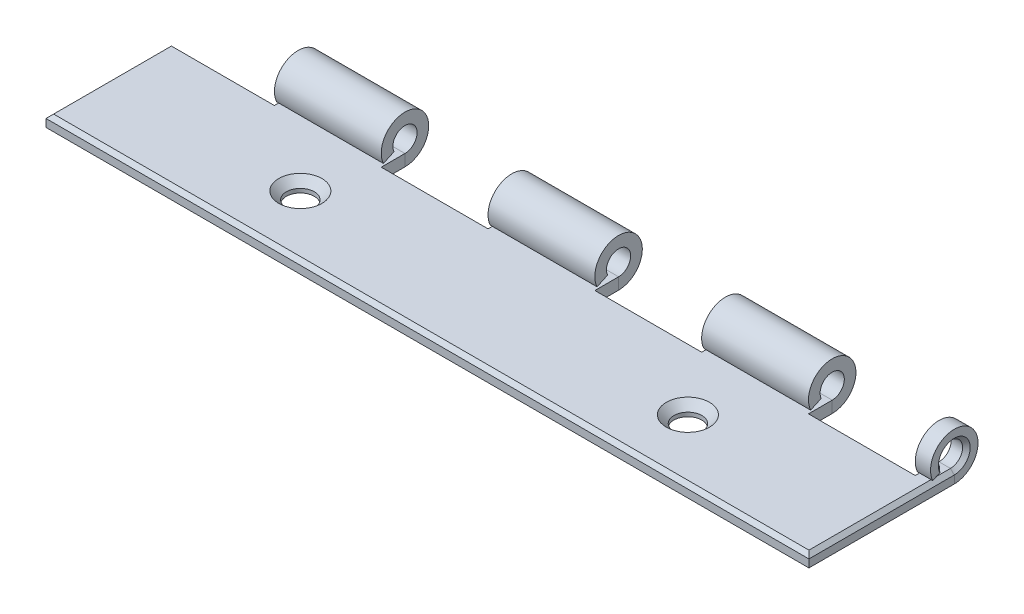
ISO-10303-21;
HEADER;
FILE_DESCRIPTION(('STEP AP214'),'2;1');
FILE_NAME('part.step','',(''),(''),'','','');
FILE_SCHEMA(('AUTOMOTIVE_DESIGN { 1 0 10303 214 1 1 1 1 }'));
ENDSEC;
DATA;
#1=APPLICATION_CONTEXT('core data for automotive mechanical design processes');
#2=APPLICATION_PROTOCOL_DEFINITION('international standard','automotive_design',2000,#1);
#3=PRODUCT_CONTEXT('',#1,'mechanical');
#4=PRODUCT('Part','Part','',(#3));
#5=PRODUCT_RELATED_PRODUCT_CATEGORY('part','',(#4));
#6=PRODUCT_DEFINITION_FORMATION('','',#4);
#7=PRODUCT_DEFINITION_CONTEXT('part definition',#1,'design');
#8=PRODUCT_DEFINITION('design','',#6,#7);
#9=PRODUCT_DEFINITION_SHAPE('','',#8);
#10=(LENGTH_UNIT() NAMED_UNIT(*) SI_UNIT(.MILLI.,.METRE.));
#11=(NAMED_UNIT(*) PLANE_ANGLE_UNIT() SI_UNIT($,.RADIAN.));
#12=(NAMED_UNIT(*) SI_UNIT($,.STERADIAN.) SOLID_ANGLE_UNIT());
#13=UNCERTAINTY_MEASURE_WITH_UNIT(LENGTH_MEASURE(1.E-05),#10,'distance_accuracy_value','');
#14=(GEOMETRIC_REPRESENTATION_CONTEXT(3) GLOBAL_UNCERTAINTY_ASSIGNED_CONTEXT((#13)) GLOBAL_UNIT_ASSIGNED_CONTEXT((#10,
#11,#12)) REPRESENTATION_CONTEXT('',''));
#15=CARTESIAN_POINT('',(0.,0.,0.));
#16=DIRECTION('',(0.,0.,1.));
#17=DIRECTION('',(1.,0.,0.));
#18=AXIS2_PLACEMENT_3D('',#15,#16,#17);
#19=CARTESIAN_POINT('',(34.,-1.524,-4.85775));
#20=DIRECTION('',(-1.,0.,0.));
#21=DIRECTION('',(0.,0.,1.));
#22=AXIS2_PLACEMENT_3D('',#19,#20,#21);
#23=PLANE('',#22);
#24=DIRECTION('',(0.,0.,1.));
#25=VECTOR('',#24,1.);
#26=CARTESIAN_POINT('',(34.,-1.524,-4.85775));
#27=LINE('',#26,#25);
#28=CARTESIAN_POINT('',(34.,-1.524,-7.96925));
#29=VERTEX_POINT('',#28);
#30=CARTESIAN_POINT('',(34.,-1.524,-4.85775));
#31=VERTEX_POINT('',#30);
#32=EDGE_CURVE('E247',#29,#31,#27,.T.);
#33=ORIENTED_EDGE('',*,*,#32,.F.);
#34=DIRECTION('',(0.,1.,0.));
#35=VECTOR('',#34,1.);
#36=CARTESIAN_POINT('',(34.,-1.524,-7.96925));
#37=LINE('',#36,#35);
#38=CARTESIAN_POINT('',(34.,0.,-7.96925));
#39=VERTEX_POINT('',#38);
#40=EDGE_CURVE('E455',#29,#39,#37,.T.);
#41=ORIENTED_EDGE('',*,*,#40,.T.);
#42=DIRECTION('',(0.,0.,-1.));
#43=VECTOR('',#42,1.);
#44=CARTESIAN_POINT('',(34.,0.,0.));
#45=LINE('',#44,#43);
#46=CARTESIAN_POINT('',(34.,0.,-4.85775));
#47=VERTEX_POINT('',#46);
#48=EDGE_CURVE('E250',#47,#39,#45,.T.);
#49=ORIENTED_EDGE('',*,*,#48,.F.);
#50=DIRECTION('',(0.,1.,0.));
#51=VECTOR('',#50,1.);
#52=CARTESIAN_POINT('',(34.,-1.524,-4.85775));
#53=LINE('',#52,#51);
#54=EDGE_CURVE('E244',#31,#47,#53,.T.);
#55=ORIENTED_EDGE('',*,*,#54,.F.);
#56=EDGE_LOOP('',(#33,#41,#49,#55));
#57=FACE_BOUND('',#56,.T.);
#58=ADVANCED_FACE('F53',(#57),#23,.F.);
#59=CARTESIAN_POINT('',(48.,-1.524,-4.85775));
#60=DIRECTION('',(1.,0.,0.));
#61=DIRECTION('',(0.,0.,-1.));
#62=AXIS2_PLACEMENT_3D('',#59,#60,#61);
#63=PLANE('',#62);
#64=DIRECTION('',(0.,0.,1.));
#65=VECTOR('',#64,1.);
#66=CARTESIAN_POINT('',(48.,0.,0.));
#67=LINE('',#66,#65);
#68=CARTESIAN_POINT('',(48.,0.,-7.96925));
#69=VERTEX_POINT('',#68);
#70=CARTESIAN_POINT('',(48.,0.,-4.85775));
#71=VERTEX_POINT('',#70);
#72=EDGE_CURVE('E442',#69,#71,#67,.T.);
#73=ORIENTED_EDGE('',*,*,#72,.F.);
#74=DIRECTION('',(0.,-1.,0.));
#75=VECTOR('',#74,1.);
#76=CARTESIAN_POINT('',(48.,0.,-7.96925));
#77=LINE('',#76,#75);
#78=CARTESIAN_POINT('',(48.,-1.524,-7.96925));
#79=VERTEX_POINT('',#78);
#80=EDGE_CURVE('E453',#69,#79,#77,.T.);
#81=ORIENTED_EDGE('',*,*,#80,.T.);
#82=DIRECTION('',(0.,0.,-1.));
#83=VECTOR('',#82,1.);
#84=CARTESIAN_POINT('',(48.,-1.524,-4.85775));
#85=LINE('',#84,#83);
#86=CARTESIAN_POINT('',(48.,-1.524,-4.85775));
#87=VERTEX_POINT('',#86);
#88=EDGE_CURVE('E271',#87,#79,#85,.T.);
#89=ORIENTED_EDGE('',*,*,#88,.F.);
#90=DIRECTION('',(0.,1.,0.));
#91=VECTOR('',#90,1.);
#92=CARTESIAN_POINT('',(48.,-1.524,-4.85775));
#93=LINE('',#92,#91);
#94=EDGE_CURVE('E254',#87,#71,#93,.T.);
#95=ORIENTED_EDGE('',*,*,#94,.T.);
#96=EDGE_LOOP('',(#73,#81,#89,#95));
#97=FACE_BOUND('',#96,.T.);
#98=ADVANCED_FACE('F530',(#97),#63,.F.);
#99=CARTESIAN_POINT('',(6.,-1.524,-4.85775));
#100=DIRECTION('',(-1.,0.,0.));
#101=DIRECTION('',(0.,0.,1.));
#102=AXIS2_PLACEMENT_3D('',#99,#100,#101);
#103=PLANE('',#102);
#104=DIRECTION('',(0.,0.,1.));
#105=VECTOR('',#104,1.);
#106=CARTESIAN_POINT('',(6.,-1.524,-4.85775));
#107=LINE('',#106,#105);
#108=CARTESIAN_POINT('',(6.,-1.524,-7.96925));
#109=VERTEX_POINT('',#108);
#110=CARTESIAN_POINT('',(6.,-1.524,-4.85775));
#111=VERTEX_POINT('',#110);
#112=EDGE_CURVE('E295',#109,#111,#107,.T.);
#113=ORIENTED_EDGE('',*,*,#112,.F.);
#114=DIRECTION('',(0.,1.,0.));
#115=VECTOR('',#114,1.);
#116=CARTESIAN_POINT('',(6.,-1.524,-7.96925));
#117=LINE('',#116,#115);
#118=CARTESIAN_POINT('',(6.,0.,-7.96925));
#119=VERTEX_POINT('',#118);
#120=EDGE_CURVE('E451',#109,#119,#117,.T.);
#121=ORIENTED_EDGE('',*,*,#120,.T.);
#122=DIRECTION('',(0.,0.,-1.));
#123=VECTOR('',#122,1.);
#124=CARTESIAN_POINT('',(6.,0.,0.));
#125=LINE('',#124,#123);
#126=CARTESIAN_POINT('',(6.,0.,-4.85775));
#127=VERTEX_POINT('',#126);
#128=EDGE_CURVE('E430',#127,#119,#125,.T.);
#129=ORIENTED_EDGE('',*,*,#128,.F.);
#130=DIRECTION('',(0.,1.,0.));
#131=VECTOR('',#130,1.);
#132=CARTESIAN_POINT('',(6.,-1.524,-4.85775));
#133=LINE('',#132,#131);
#134=EDGE_CURVE('E301',#111,#127,#133,.T.);
#135=ORIENTED_EDGE('',*,*,#134,.F.);
#136=EDGE_LOOP('',(#113,#121,#129,#135));
#137=FACE_BOUND('',#136,.T.);
#138=ADVANCED_FACE('F536',(#137),#103,.F.);
#139=CARTESIAN_POINT('',(20.,-1.524,-4.85775));
#140=DIRECTION('',(1.,0.,0.));
#141=DIRECTION('',(0.,0.,-1.));
#142=AXIS2_PLACEMENT_3D('',#139,#140,#141);
#143=PLANE('',#142);
#144=DIRECTION('',(0.,0.,1.));
#145=VECTOR('',#144,1.);
#146=CARTESIAN_POINT('',(20.,0.,0.));
#147=LINE('',#146,#145);
#148=CARTESIAN_POINT('',(20.,0.,-7.96925));
#149=VERTEX_POINT('',#148);
#150=CARTESIAN_POINT('',(20.,0.,-4.85775));
#151=VERTEX_POINT('',#150);
#152=EDGE_CURVE('E436',#149,#151,#147,.T.);
#153=ORIENTED_EDGE('',*,*,#152,.F.);
#154=DIRECTION('',(0.,-1.,0.));
#155=VECTOR('',#154,1.);
#156=CARTESIAN_POINT('',(20.,0.,-7.96925));
#157=LINE('',#156,#155);
#158=CARTESIAN_POINT('',(20.,-1.524,-7.96925));
#159=VERTEX_POINT('',#158);
#160=EDGE_CURVE('E449',#149,#159,#157,.T.);
#161=ORIENTED_EDGE('',*,*,#160,.T.);
#162=DIRECTION('',(0.,0.,-1.));
#163=VECTOR('',#162,1.);
#164=CARTESIAN_POINT('',(20.,-1.524,-4.85775));
#165=LINE('',#164,#163);
#166=CARTESIAN_POINT('',(20.,-1.524,-4.85775));
#167=VERTEX_POINT('',#166);
#168=EDGE_CURVE('E293',#167,#159,#165,.T.);
#169=ORIENTED_EDGE('',*,*,#168,.F.);
#170=DIRECTION('',(0.,1.,0.));
#171=VECTOR('',#170,1.);
#172=CARTESIAN_POINT('',(20.,-1.524,-4.85775));
#173=LINE('',#172,#171);
#174=EDGE_CURVE('E302',#167,#151,#173,.T.);
#175=ORIENTED_EDGE('',*,*,#174,.T.);
#176=EDGE_LOOP('',(#153,#161,#169,#175));
#177=FACE_BOUND('',#176,.T.);
#178=ADVANCED_FACE('F871',(#177),#143,.F.);
#179=CARTESIAN_POINT('',(-22.,-1.524,-4.85775));
#180=DIRECTION('',(-1.,0.,0.));
#181=DIRECTION('',(0.,0.,1.));
#182=AXIS2_PLACEMENT_3D('',#179,#180,#181);
#183=PLANE('',#182);
#184=DIRECTION('',(0.,0.,1.));
#185=VECTOR('',#184,1.);
#186=CARTESIAN_POINT('',(-22.,-1.524,-4.85775));
#187=LINE('',#186,#185);
#188=CARTESIAN_POINT('',(-22.,-1.524,-7.96925));
#189=VERTEX_POINT('',#188);
#190=CARTESIAN_POINT('',(-22.,-1.524,-4.85775));
#191=VERTEX_POINT('',#190);
#192=EDGE_CURVE('E326',#189,#191,#187,.T.);
#193=ORIENTED_EDGE('',*,*,#192,.F.);
#194=DIRECTION('',(0.,1.,0.));
#195=VECTOR('',#194,1.);
#196=CARTESIAN_POINT('',(-22.,-1.524,-7.96925));
#197=LINE('',#196,#195);
#198=CARTESIAN_POINT('',(-22.,0.,-7.96925));
#199=VERTEX_POINT('',#198);
#200=EDGE_CURVE('E447',#189,#199,#197,.T.);
#201=ORIENTED_EDGE('',*,*,#200,.T.);
#202=DIRECTION('',(0.,0.,-1.));
#203=VECTOR('',#202,1.);
#204=CARTESIAN_POINT('',(-22.,0.,0.));
#205=LINE('',#204,#203);
#206=CARTESIAN_POINT('',(-22.,0.,-4.85775));
#207=VERTEX_POINT('',#206);
#208=EDGE_CURVE('E340',#207,#199,#205,.T.);
#209=ORIENTED_EDGE('',*,*,#208,.F.);
#210=DIRECTION('',(0.,1.,0.));
#211=VECTOR('',#210,1.);
#212=CARTESIAN_POINT('',(-22.,-1.524,-4.85775));
#213=LINE('',#212,#211);
#214=EDGE_CURVE('E332',#191,#207,#213,.T.);
#215=ORIENTED_EDGE('',*,*,#214,.F.);
#216=EDGE_LOOP('',(#193,#201,#209,#215));
#217=FACE_BOUND('',#216,.T.);
#218=ADVANCED_FACE('F888',(#217),#183,.F.);
#219=CARTESIAN_POINT('',(-8.,-1.524,-4.85775));
#220=DIRECTION('',(1.,0.,0.));
#221=DIRECTION('',(0.,0.,-1.));
#222=AXIS2_PLACEMENT_3D('',#219,#220,#221);
#223=PLANE('',#222);
#224=DIRECTION('',(0.,0.,1.));
#225=VECTOR('',#224,1.);
#226=CARTESIAN_POINT('',(-8.,0.,0.));
#227=LINE('',#226,#225);
#228=CARTESIAN_POINT('',(-8.00000000000001,0.,-7.96925));
#229=VERTEX_POINT('',#228);
#230=CARTESIAN_POINT('',(-8.,0.,-4.85775));
#231=VERTEX_POINT('',#230);
#232=EDGE_CURVE('E348',#229,#231,#227,.T.);
#233=ORIENTED_EDGE('',*,*,#232,.F.);
#234=DIRECTION('',(0.,-1.,0.));
#235=VECTOR('',#234,1.);
#236=CARTESIAN_POINT('',(-8.00000000000001,0.,-7.96925));
#237=LINE('',#236,#235);
#238=CARTESIAN_POINT('',(-8.,-1.524,-7.96925));
#239=VERTEX_POINT('',#238);
#240=EDGE_CURVE('E445',#229,#239,#237,.T.);
#241=ORIENTED_EDGE('',*,*,#240,.T.);
#242=DIRECTION('',(0.,0.,-1.));
#243=VECTOR('',#242,1.);
#244=CARTESIAN_POINT('',(-8.,-1.524,-4.85775));
#245=LINE('',#244,#243);
#246=CARTESIAN_POINT('',(-8.,-1.524,-4.85775));
#247=VERTEX_POINT('',#246);
#248=EDGE_CURVE('E323',#247,#239,#245,.T.);
#249=ORIENTED_EDGE('',*,*,#248,.F.);
#250=DIRECTION('',(0.,1.,0.));
#251=VECTOR('',#250,1.);
#252=CARTESIAN_POINT('',(-8.,-1.524,-4.85775));
#253=LINE('',#252,#251);
#254=EDGE_CURVE('E333',#247,#231,#253,.T.);
#255=ORIENTED_EDGE('',*,*,#254,.T.);
#256=EDGE_LOOP('',(#233,#241,#249,#255));
#257=FACE_BOUND('',#256,.T.);
#258=ADVANCED_FACE('F658',(#257),#223,.F.);
#259=CARTESIAN_POINT('',(0.,0.916593509486624,-6.53048638807933));
#260=DIRECTION('',(0.,0.906307787036645,0.42261826174071));
#261=DIRECTION('',(-1.,0.,0.));
#262=AXIS2_PLACEMENT_3D('',#259,#260,#261);
#263=PLANE('',#262);
#264=DIRECTION('',(-1.,0.,0.));
#265=VECTOR('',#264,1.);
#266=CARTESIAN_POINT('',(-50.,0.916593509486624,-6.53048638807933));
#267=LINE('',#266,#265);
#268=CARTESIAN_POINT('',(49.5,0.916593509486624,-6.53048638807933));
#269=VERTEX_POINT('',#268);
#270=CARTESIAN_POINT('',(48.,0.916593509486624,-6.53048638807933));
#271=VERTEX_POINT('',#270);
#272=EDGE_CURVE('E401',#269,#271,#267,.T.);
#273=ORIENTED_EDGE('',*,*,#272,.F.);
#274=DIRECTION('',(0.707106781186548,-0.298836238730127,0.640856382055785));
#275=VECTOR('',#274,1.);
#276=CARTESIAN_POINT('',(47.9125,1.5875,-7.96925));
#277=LINE('',#276,#275);
#278=CARTESIAN_POINT('',(50.,0.705284378616269,-6.077332494561));
#279=VERTEX_POINT('',#278);
#280=EDGE_CURVE('E460',#269,#279,#277,.T.);
#281=ORIENTED_EDGE('',*,*,#280,.T.);
#282=DIRECTION('',(0.,-0.42261826174071,0.906307787036645));
#283=VECTOR('',#282,1.);
#284=CARTESIAN_POINT('',(50.,0.916593509486624,-6.53048638807933));
#285=LINE('',#284,#283);
#286=CARTESIAN_POINT('',(50.,0.272523278593782,-5.14927332063548));
#287=VERTEX_POINT('',#286);
#288=EDGE_CURVE('E405',#279,#287,#285,.T.);
#289=ORIENTED_EDGE('',*,*,#288,.T.);
#290=DIRECTION('',(-1.,0.,0.));
#291=VECTOR('',#290,1.);
#292=CARTESIAN_POINT('',(-50.,0.272523278593782,-5.14927332063548));
#293=LINE('',#292,#291);
#294=CARTESIAN_POINT('',(48.,0.272523278593782,-5.14927332063548));
#295=VERTEX_POINT('',#294);
#296=EDGE_CURVE('E391',#287,#295,#293,.T.);
#297=ORIENTED_EDGE('',*,*,#296,.T.);
#298=DIRECTION('',(0.,0.42261826174071,-0.906307787036645));
#299=VECTOR('',#298,1.);
#300=CARTESIAN_POINT('',(48.,0.916593509486624,-6.53048638807933));
#301=LINE('',#300,#299);
#302=EDGE_CURVE('E288',#271,#295,#301,.F.);
#303=ORIENTED_EDGE('',*,*,#302,.F.);
#304=EDGE_LOOP('',(#273,#281,#289,#297,#303));
#305=FACE_BOUND('',#304,.T.);
#306=ADVANCED_FACE('F579',(#305),#263,.F.);
#307=CARTESIAN_POINT('',(-50.,1.5875,-7.96925));
#308=DIRECTION('',(-1.,0.,0.));
#309=DIRECTION('',(0.,-0.42261826174071,0.906307787036645));
#310=AXIS2_PLACEMENT_3D('',#307,#308,#309);
#311=CYLINDRICAL_SURFACE('',#310,3.1115);
#312=DIRECTION('',(-1.,0.,0.));
#313=VECTOR('',#312,1.);
#314=CARTESIAN_POINT('',(-50.,-1.524,-7.96925000000001));
#315=LINE('',#314,#313);
#316=CARTESIAN_POINT('',(50.,-1.524,-7.96925000000001));
#317=VERTEX_POINT('',#316);
#318=EDGE_CURVE('E387',#79,#317,#315,.F.);
#319=ORIENTED_EDGE('',*,*,#318,.F.);
#320=CARTESIAN_POINT('',(48.,1.5875,-7.96925));
#321=DIRECTION('',(1.,0.,0.));
#322=DIRECTION('',(0.,0.,-1.));
#323=AXIS2_PLACEMENT_3D('',#320,#321,#322);
#324=CIRCLE('',#323,3.1115);
#325=EDGE_CURVE('E290',#295,#79,#324,.F.);
#326=ORIENTED_EDGE('',*,*,#325,.F.);
#327=ORIENTED_EDGE('',*,*,#296,.F.);
#328=CARTESIAN_POINT('',(50.,1.5875,-7.96925));
#329=DIRECTION('',(-1.,0.,0.));
#330=DIRECTION('',(0.,0.,1.));
#331=AXIS2_PLACEMENT_3D('',#328,#329,#330);
#332=CIRCLE('',#331,3.1115);
#333=EDGE_CURVE('E385',#317,#287,#332,.F.);
#334=ORIENTED_EDGE('',*,*,#333,.F.);
#335=EDGE_LOOP('',(#319,#326,#327,#334));
#336=FACE_BOUND('',#335,.T.);
#337=ADVANCED_FACE('F588',(#336),#311,.T.);
#338=CARTESIAN_POINT('',(-50.,1.5875,-7.96925));
#339=DIRECTION('',(-1.,0.,0.));
#340=DIRECTION('',(0.,-0.42261826174071,0.906307787036645));
#341=AXIS2_PLACEMENT_3D('',#338,#339,#340);
#342=CYLINDRICAL_SURFACE('',#341,1.5875);
#343=DIRECTION('',(-1.,0.,0.));
#344=VECTOR('',#343,1.);
#345=CARTESIAN_POINT('',(-50.,0.,-7.96925));
#346=LINE('',#345,#344);
#347=CARTESIAN_POINT('',(49.5,0.,-7.96925));
#348=VERTEX_POINT('',#347);
#349=EDGE_CURVE('E400',#69,#348,#346,.F.);
#350=ORIENTED_EDGE('',*,*,#349,.T.);
#351=CARTESIAN_POINT('',(49.5,1.5875,-7.96925));
#352=DIRECTION('',(1.,0.,0.));
#353=DIRECTION('',(0.,0.,-1.));
#354=AXIS2_PLACEMENT_3D('',#351,#352,#353);
#355=CIRCLE('',#354,1.5875);
#356=EDGE_CURVE('E457',#348,#269,#355,.T.);
#357=ORIENTED_EDGE('',*,*,#356,.T.);
#358=ORIENTED_EDGE('',*,*,#272,.T.);
#359=CARTESIAN_POINT('',(48.,1.5875,-7.96925));
#360=DIRECTION('',(1.,0.,0.));
#361=DIRECTION('',(0.,0.,-1.));
#362=AXIS2_PLACEMENT_3D('',#359,#360,#361);
#363=CIRCLE('',#362,1.5875);
#364=EDGE_CURVE('E285',#271,#69,#363,.F.);
#365=ORIENTED_EDGE('',*,*,#364,.T.);
#366=EDGE_LOOP('',(#350,#357,#358,#365));
#367=FACE_BOUND('',#366,.T.);
#368=ADVANCED_FACE('F567',(#367),#342,.F.);
#369=DIRECTION('',(0.,-0.42261826174071,0.906307787036645));
#370=VECTOR('',#369,1.);
#371=CARTESIAN_POINT('',(34.,0.916593509486624,-6.53048638807933));
#372=LINE('',#371,#370);
#373=CARTESIAN_POINT('',(34.,0.272523278593782,-5.14927332063548));
#374=VERTEX_POINT('',#373);
#375=CARTESIAN_POINT('',(34.,0.916593509486624,-6.53048638807933));
#376=VERTEX_POINT('',#375);
#377=EDGE_CURVE('E281',#374,#376,#372,.F.);
#378=ORIENTED_EDGE('',*,*,#377,.F.);
#379=CARTESIAN_POINT('',(20.,0.272523278593782,-5.14927332063548));
#380=VERTEX_POINT('',#379);
#381=EDGE_CURVE('E394',#374,#380,#293,.T.);
#382=ORIENTED_EDGE('',*,*,#381,.T.);
#383=DIRECTION('',(0.,0.42261826174071,-0.906307787036645));
#384=VECTOR('',#383,1.);
#385=CARTESIAN_POINT('',(20.,0.916593509486624,-6.53048638807933));
#386=LINE('',#385,#384);
#387=CARTESIAN_POINT('',(20.,0.916593509486624,-6.53048638807933));
#388=VERTEX_POINT('',#387);
#389=EDGE_CURVE('E317',#388,#380,#386,.F.);
#390=ORIENTED_EDGE('',*,*,#389,.F.);
#391=EDGE_CURVE('E403',#376,#388,#267,.T.);
#392=ORIENTED_EDGE('',*,*,#391,.F.);
#393=EDGE_LOOP('',(#378,#382,#390,#392));
#394=FACE_BOUND('',#393,.T.);
#395=ADVANCED_FACE('F636',(#394),#263,.F.);
#396=CARTESIAN_POINT('',(34.,1.5875,-7.96925));
#397=DIRECTION('',(-1.,0.,0.));
#398=DIRECTION('',(0.,0.,1.));
#399=AXIS2_PLACEMENT_3D('',#396,#397,#398);
#400=CIRCLE('',#399,3.1115);
#401=EDGE_CURVE('E283',#29,#374,#400,.F.);
#402=ORIENTED_EDGE('',*,*,#401,.F.);
#403=EDGE_CURVE('E269',#159,#29,#315,.F.);
#404=ORIENTED_EDGE('',*,*,#403,.F.);
#405=CARTESIAN_POINT('',(20.,1.5875,-7.96925));
#406=DIRECTION('',(1.,0.,0.));
#407=DIRECTION('',(0.,0.,-1.));
#408=AXIS2_PLACEMENT_3D('',#405,#406,#407);
#409=CIRCLE('',#408,3.1115);
#410=EDGE_CURVE('E320',#380,#159,#409,.F.);
#411=ORIENTED_EDGE('',*,*,#410,.F.);
#412=ORIENTED_EDGE('',*,*,#381,.F.);
#413=EDGE_LOOP('',(#402,#404,#411,#412));
#414=FACE_BOUND('',#413,.T.);
#415=ADVANCED_FACE('F668',(#414),#311,.T.);
#416=EDGE_CURVE('E559',#149,#39,#346,.F.);
#417=ORIENTED_EDGE('',*,*,#416,.T.);
#418=CARTESIAN_POINT('',(34.,1.5875,-7.96925));
#419=DIRECTION('',(-1.,0.,0.));
#420=DIRECTION('',(0.,0.,1.));
#421=AXIS2_PLACEMENT_3D('',#418,#419,#420);
#422=CIRCLE('',#421,1.5875);
#423=EDGE_CURVE('E277',#39,#376,#422,.F.);
#424=ORIENTED_EDGE('',*,*,#423,.T.);
#425=ORIENTED_EDGE('',*,*,#391,.T.);
#426=CARTESIAN_POINT('',(20.,1.5875,-7.96925));
#427=DIRECTION('',(1.,0.,0.));
#428=DIRECTION('',(0.,0.,-1.));
#429=AXIS2_PLACEMENT_3D('',#426,#427,#428);
#430=CIRCLE('',#429,1.5875);
#431=EDGE_CURVE('E314',#388,#149,#430,.F.);
#432=ORIENTED_EDGE('',*,*,#431,.T.);
#433=EDGE_LOOP('',(#417,#424,#425,#432));
#434=FACE_BOUND('',#433,.T.);
#435=ADVANCED_FACE('F560',(#434),#342,.F.);
#436=DIRECTION('',(0.,-0.42261826174071,0.906307787036645));
#437=VECTOR('',#436,1.);
#438=CARTESIAN_POINT('',(6.,0.916593509486624,-6.53048638807933));
#439=LINE('',#438,#437);
#440=CARTESIAN_POINT('',(6.,0.272523278593782,-5.14927332063548));
#441=VERTEX_POINT('',#440);
#442=CARTESIAN_POINT('',(6.,0.916593509486624,-6.53048638807933));
#443=VERTEX_POINT('',#442);
#444=EDGE_CURVE('E310',#441,#443,#439,.F.);
#445=ORIENTED_EDGE('',*,*,#444,.F.);
#446=CARTESIAN_POINT('',(-8.,0.272523278593782,-5.14927332063548));
#447=VERTEX_POINT('',#446);
#448=EDGE_CURVE('E639',#441,#447,#293,.T.);
#449=ORIENTED_EDGE('',*,*,#448,.T.);
#450=DIRECTION('',(0.,0.42261826174071,-0.906307787036645));
#451=VECTOR('',#450,1.);
#452=CARTESIAN_POINT('',(-8.,0.916593509486624,-6.53048638807933));
#453=LINE('',#452,#451);
#454=CARTESIAN_POINT('',(-8.00000000000001,0.916593509486624,-6.53048638807933));
#455=VERTEX_POINT('',#454);
#456=EDGE_CURVE('E345',#455,#447,#453,.F.);
#457=ORIENTED_EDGE('',*,*,#456,.F.);
#458=EDGE_CURVE('E626',#443,#455,#267,.T.);
#459=ORIENTED_EDGE('',*,*,#458,.F.);
#460=EDGE_LOOP('',(#445,#449,#457,#459));
#461=FACE_BOUND('',#460,.T.);
#462=ADVANCED_FACE('F644',(#461),#263,.F.);
#463=CARTESIAN_POINT('',(6.,1.5875,-7.96925));
#464=DIRECTION('',(-1.,0.,0.));
#465=DIRECTION('',(0.,0.,1.));
#466=AXIS2_PLACEMENT_3D('',#463,#464,#465);
#467=CIRCLE('',#466,3.1115);
#468=EDGE_CURVE('E312',#109,#441,#467,.F.);
#469=ORIENTED_EDGE('',*,*,#468,.F.);
#470=EDGE_CURVE('E386',#239,#109,#315,.F.);
#471=ORIENTED_EDGE('',*,*,#470,.F.);
#472=CARTESIAN_POINT('',(-8.00000000000001,1.5875,-7.96925));
#473=DIRECTION('',(1.,0.,0.));
#474=DIRECTION('',(0.,0.,-1.));
#475=AXIS2_PLACEMENT_3D('',#472,#473,#474);
#476=CIRCLE('',#475,3.1115);
#477=EDGE_CURVE('E351',#447,#239,#476,.F.);
#478=ORIENTED_EDGE('',*,*,#477,.F.);
#479=ORIENTED_EDGE('',*,*,#448,.F.);
#480=EDGE_LOOP('',(#469,#471,#478,#479));
#481=FACE_BOUND('',#480,.T.);
#482=ADVANCED_FACE('F651',(#481),#311,.T.);
#483=EDGE_CURVE('E399',#229,#119,#346,.F.);
#484=ORIENTED_EDGE('',*,*,#483,.T.);
#485=CARTESIAN_POINT('',(6.,1.5875,-7.96925));
#486=DIRECTION('',(-1.,0.,0.));
#487=DIRECTION('',(0.,0.,1.));
#488=AXIS2_PLACEMENT_3D('',#485,#486,#487);
#489=CIRCLE('',#488,1.5875);
#490=EDGE_CURVE('E305',#119,#443,#489,.F.);
#491=ORIENTED_EDGE('',*,*,#490,.T.);
#492=ORIENTED_EDGE('',*,*,#458,.T.);
#493=CARTESIAN_POINT('',(-8.00000000000001,1.5875,-7.96925));
#494=DIRECTION('',(1.,0.,0.));
#495=DIRECTION('',(0.,0.,-1.));
#496=AXIS2_PLACEMENT_3D('',#493,#494,#495);
#497=CIRCLE('',#496,1.5875);
#498=EDGE_CURVE('E427',#455,#229,#497,.F.);
#499=ORIENTED_EDGE('',*,*,#498,.T.);
#500=EDGE_LOOP('',(#484,#491,#492,#499));
#501=FACE_BOUND('',#500,.T.);
#502=ADVANCED_FACE('F660',(#501),#342,.F.);
#503=CARTESIAN_POINT('',(-36.,-1.524,-4.85775));
#504=DIRECTION('',(1.,0.,0.));
#505=DIRECTION('',(0.,0.,-1.));
#506=AXIS2_PLACEMENT_3D('',#503,#504,#505);
#507=PLANE('',#506);
#508=DIRECTION('',(0.,0.,1.));
#509=VECTOR('',#508,1.);
#510=CARTESIAN_POINT('',(-36.,0.,0.));
#511=LINE('',#510,#509);
#512=CARTESIAN_POINT('',(-36.,0.,-7.96925));
#513=VERTEX_POINT('',#512);
#514=CARTESIAN_POINT('',(-36.,0.,-4.85775));
#515=VERTEX_POINT('',#514);
#516=EDGE_CURVE('E372',#513,#515,#511,.T.);
#517=ORIENTED_EDGE('',*,*,#516,.F.);
#518=DIRECTION('',(0.,-1.,0.));
#519=VECTOR('',#518,1.);
#520=CARTESIAN_POINT('',(-36.,0.,-7.96925));
#521=LINE('',#520,#519);
#522=CARTESIAN_POINT('',(-36.,-1.524,-7.96925));
#523=VERTEX_POINT('',#522);
#524=EDGE_CURVE('E422',#513,#523,#521,.T.);
#525=ORIENTED_EDGE('',*,*,#524,.T.);
#526=DIRECTION('',(0.,0.,-1.));
#527=VECTOR('',#526,1.);
#528=CARTESIAN_POINT('',(-36.,-1.524,-4.85775));
#529=LINE('',#528,#527);
#530=CARTESIAN_POINT('',(-36.,-1.524,-4.85775));
#531=VERTEX_POINT('',#530);
#532=EDGE_CURVE('E357',#531,#523,#529,.T.);
#533=ORIENTED_EDGE('',*,*,#532,.F.);
#534=DIRECTION('',(0.,1.,0.));
#535=VECTOR('',#534,1.);
#536=CARTESIAN_POINT('',(-36.,-1.524,-4.85775));
#537=LINE('',#536,#535);
#538=EDGE_CURVE('E364',#531,#515,#537,.T.);
#539=ORIENTED_EDGE('',*,*,#538,.T.);
#540=EDGE_LOOP('',(#517,#525,#533,#539));
#541=FACE_BOUND('',#540,.T.);
#542=ADVANCED_FACE('F609',(#541),#507,.F.);
#543=CARTESIAN_POINT('',(-50.,-1.524,11.08075));
#544=DIRECTION('',(-1.,0.,0.));
#545=DIRECTION('',(0.,0.,1.));
#546=AXIS2_PLACEMENT_3D('',#543,#544,#545);
#547=PLANE('',#546);
#548=DIRECTION('',(0.,1.,0.));
#549=VECTOR('',#548,1.);
#550=CARTESIAN_POINT('',(-50.,-1.524,11.08075));
#551=LINE('',#550,#549);
#552=CARTESIAN_POINT('',(-50.,-1.524,11.08075));
#553=VERTEX_POINT('',#552);
#554=CARTESIAN_POINT('',(-50.,-0.5,11.08075));
#555=VERTEX_POINT('',#554);
#556=EDGE_CURVE('E415',#553,#555,#551,.T.);
#557=ORIENTED_EDGE('',*,*,#556,.T.);
#558=DIRECTION('',(0.,0.,-1.));
#559=VECTOR('',#558,1.);
#560=CARTESIAN_POINT('',(-50.,-0.5,-4.85775));
#561=LINE('',#560,#559);
#562=CARTESIAN_POINT('',(-50.,-0.500000000000001,-4.85775));
#563=VERTEX_POINT('',#562);
#564=EDGE_CURVE('E470',#555,#563,#561,.T.);
#565=ORIENTED_EDGE('',*,*,#564,.T.);
#566=DIRECTION('',(0.,1.,0.));
#567=VECTOR('',#566,1.);
#568=CARTESIAN_POINT('',(-50.,-1.524,-4.85775));
#569=LINE('',#568,#567);
#570=CARTESIAN_POINT('',(-50.,-1.524,-4.85775));
#571=VERTEX_POINT('',#570);
#572=EDGE_CURVE('E363',#571,#563,#569,.T.);
#573=ORIENTED_EDGE('',*,*,#572,.F.);
#574=DIRECTION('',(0.,0.,1.));
#575=VECTOR('',#574,1.);
#576=CARTESIAN_POINT('',(-50.,-1.524,11.08075));
#577=LINE('',#576,#575);
#578=EDGE_CURVE('E410',#571,#553,#577,.T.);
#579=ORIENTED_EDGE('',*,*,#578,.T.);
#580=EDGE_LOOP('',(#557,#565,#573,#579));
#581=FACE_BOUND('',#580,.T.);
#582=ADVANCED_FACE('F595',(#581),#547,.T.);
#583=CARTESIAN_POINT('',(50.,-1.524,11.08075));
#584=DIRECTION('',(1.,0.,0.));
#585=DIRECTION('',(0.,0.,-1.));
#586=AXIS2_PLACEMENT_3D('',#583,#584,#585);
#587=PLANE('',#586);
#588=DIRECTION('',(0.,-1.,0.));
#589=VECTOR('',#588,1.);
#590=CARTESIAN_POINT('',(50.,0.,-7.96925));
#591=LINE('',#590,#589);
#592=CARTESIAN_POINT('',(50.,-0.5,-7.96925));
#593=VERTEX_POINT('',#592);
#594=EDGE_CURVE('E390',#593,#317,#591,.T.);
#595=ORIENTED_EDGE('',*,*,#594,.F.);
#596=DIRECTION('',(0.,0.,1.));
#597=VECTOR('',#596,1.);
#598=CARTESIAN_POINT('',(50.,-0.5,11.08075));
#599=LINE('',#598,#597);
#600=CARTESIAN_POINT('',(50.,-0.5,11.08075));
#601=VERTEX_POINT('',#600);
#602=EDGE_CURVE('E68',#593,#601,#599,.T.);
#603=ORIENTED_EDGE('',*,*,#602,.T.);
#604=DIRECTION('',(0.,1.,0.));
#605=VECTOR('',#604,1.);
#606=CARTESIAN_POINT('',(50.,-1.524,11.08075));
#607=LINE('',#606,#605);
#608=CARTESIAN_POINT('',(50.,-1.524,11.08075));
#609=VERTEX_POINT('',#608);
#610=EDGE_CURVE('E416',#609,#601,#607,.T.);
#611=ORIENTED_EDGE('',*,*,#610,.F.);
#612=DIRECTION('',(0.,0.,-1.));
#613=VECTOR('',#612,1.);
#614=CARTESIAN_POINT('',(50.,-1.524,11.08075));
#615=LINE('',#614,#613);
#616=EDGE_CURVE('E407',#609,#317,#615,.T.);
#617=ORIENTED_EDGE('',*,*,#616,.T.);
#618=EDGE_LOOP('',(#595,#603,#611,#617));
#619=FACE_BOUND('',#618,.T.);
#620=ADVANCED_FACE('F526',(#619),#587,.T.);
#621=CARTESIAN_POINT('',(-50.,-1.524,11.08075));
#622=DIRECTION('',(0.,0.,1.));
#623=DIRECTION('',(1.,0.,0.));
#624=AXIS2_PLACEMENT_3D('',#621,#622,#623);
#625=PLANE('',#624);
#626=ORIENTED_EDGE('',*,*,#610,.T.);
#627=DIRECTION('',(-1.,0.,0.));
#628=VECTOR('',#627,1.);
#629=CARTESIAN_POINT('',(-50.,-0.5,11.08075));
#630=LINE('',#629,#628);
#631=EDGE_CURVE('E75',#601,#555,#630,.T.);
#632=ORIENTED_EDGE('',*,*,#631,.T.);
#633=ORIENTED_EDGE('',*,*,#556,.F.);
#634=DIRECTION('',(1.,0.,0.));
#635=VECTOR('',#634,1.);
#636=CARTESIAN_POINT('',(-50.,-1.524,11.08075));
#637=LINE('',#636,#635);
#638=EDGE_CURVE('E412',#553,#609,#637,.T.);
#639=ORIENTED_EDGE('',*,*,#638,.T.);
#640=EDGE_LOOP('',(#626,#632,#633,#639));
#641=FACE_BOUND('',#640,.T.);
#642=ADVANCED_FACE('F518',(#641),#625,.T.);
#643=CARTESIAN_POINT('',(0.,-1.524,0.));
#644=DIRECTION('',(0.,-1.,0.));
#645=DIRECTION('',(0.,0.,-1.));
#646=AXIS2_PLACEMENT_3D('',#643,#644,#645);
#647=PLANE('',#646);
#648=CARTESIAN_POINT('',(26.2,-1.524,3.14324999999998));
#649=DIRECTION('',(0.,-1.,0.));
#650=DIRECTION('',(0.,0.,-1.));
#651=AXIS2_PLACEMENT_3D('',#648,#649,#650);
#652=CIRCLE('',#651,1.82879999999998);
#653=CARTESIAN_POINT('',(26.2,-1.524,1.31445));
#654=VERTEX_POINT('',#653);
#655=EDGE_CURVE('E510',#654,#654,#652,.T.);
#656=ORIENTED_EDGE('',*,*,#655,.F.);
#657=EDGE_LOOP('',(#656));
#658=FACE_BOUND('',#657,.T.);
#659=CARTESIAN_POINT('',(-24.6,-1.524,3.14324999999998));
#660=DIRECTION('',(0.,-1.,0.));
#661=DIRECTION('',(0.,0.,-1.));
#662=AXIS2_PLACEMENT_3D('',#659,#660,#661);
#663=CIRCLE('',#662,1.82879999999998);
#664=CARTESIAN_POINT('',(-24.6,-1.524,1.31445));
#665=VERTEX_POINT('',#664);
#666=EDGE_CURVE('E481',#665,#665,#663,.T.);
#667=ORIENTED_EDGE('',*,*,#666,.F.);
#668=EDGE_LOOP('',(#667));
#669=FACE_BOUND('',#668,.T.);
#670=ORIENTED_EDGE('',*,*,#88,.T.);
#671=ORIENTED_EDGE('',*,*,#318,.T.);
#672=ORIENTED_EDGE('',*,*,#616,.F.);
#673=ORIENTED_EDGE('',*,*,#638,.F.);
#674=ORIENTED_EDGE('',*,*,#578,.F.);
#675=DIRECTION('',(1.,0.,0.));
#676=VECTOR('',#675,1.);
#677=CARTESIAN_POINT('',(-36.,-1.524,-4.85775));
#678=LINE('',#677,#676);
#679=EDGE_CURVE('E360',#571,#531,#678,.T.);
#680=ORIENTED_EDGE('',*,*,#679,.T.);
#681=ORIENTED_EDGE('',*,*,#532,.T.);
#682=EDGE_CURVE('E382',#523,#189,#315,.F.);
#683=ORIENTED_EDGE('',*,*,#682,.T.);
#684=ORIENTED_EDGE('',*,*,#192,.T.);
#685=DIRECTION('',(1.,0.,0.));
#686=VECTOR('',#685,1.);
#687=CARTESIAN_POINT('',(-8.,-1.524,-4.85775));
#688=LINE('',#687,#686);
#689=EDGE_CURVE('E329',#191,#247,#688,.T.);
#690=ORIENTED_EDGE('',*,*,#689,.T.);
#691=ORIENTED_EDGE('',*,*,#248,.T.);
#692=ORIENTED_EDGE('',*,*,#470,.T.);
#693=ORIENTED_EDGE('',*,*,#112,.T.);
#694=DIRECTION('',(1.,0.,0.));
#695=VECTOR('',#694,1.);
#696=CARTESIAN_POINT('',(20.,-1.524,-4.85775));
#697=LINE('',#696,#695);
#698=EDGE_CURVE('E298',#111,#167,#697,.T.);
#699=ORIENTED_EDGE('',*,*,#698,.T.);
#700=ORIENTED_EDGE('',*,*,#168,.T.);
#701=ORIENTED_EDGE('',*,*,#403,.T.);
#702=ORIENTED_EDGE('',*,*,#32,.T.);
#703=DIRECTION('',(1.,0.,0.));
#704=VECTOR('',#703,1.);
#705=CARTESIAN_POINT('',(48.,-1.524,-4.85775));
#706=LINE('',#705,#704);
#707=EDGE_CURVE('E255',#31,#87,#706,.T.);
#708=ORIENTED_EDGE('',*,*,#707,.T.);
#709=EDGE_LOOP('',(#670,#671,#672,#673,#674,#680,#681,#683,#684,#690,#691,#692,#693,#699,#700,
#701,#702,#708));
#710=FACE_BOUND('',#709,.T.);
#711=ADVANCED_FACE('F266',(#658,#669,#710),#647,.T.);
#712=CARTESIAN_POINT('',(0.,0.,0.));
#713=DIRECTION('',(0.,-1.,0.));
#714=DIRECTION('',(0.,0.,-1.));
#715=AXIS2_PLACEMENT_3D('',#712,#713,#714);
#716=PLANE('',#715);
#717=CARTESIAN_POINT('',(26.2,0.,3.14324999999998));
#718=DIRECTION('',(0.,-1.,0.));
#719=DIRECTION('',(0.,0.,-1.));
#720=AXIS2_PLACEMENT_3D('',#717,#718,#719);
#721=CIRCLE('',#720,2.82879999999998);
#722=CARTESIAN_POINT('',(26.2,0.,0.314450000000006));
#723=VERTEX_POINT('',#722);
#724=EDGE_CURVE('E61',#723,#723,#721,.T.);
#725=ORIENTED_EDGE('',*,*,#724,.T.);
#726=EDGE_LOOP('',(#725));
#727=FACE_BOUND('',#726,.T.);
#728=CARTESIAN_POINT('',(-24.6,0.,3.14324999999998));
#729=DIRECTION('',(0.,-1.,0.));
#730=DIRECTION('',(0.,0.,-1.));
#731=AXIS2_PLACEMENT_3D('',#728,#729,#730);
#732=CIRCLE('',#731,2.82879999999998);
#733=CARTESIAN_POINT('',(-24.6,0.,0.314450000000006));
#734=VERTEX_POINT('',#733);
#735=EDGE_CURVE('E488',#734,#734,#732,.T.);
#736=ORIENTED_EDGE('',*,*,#735,.T.);
#737=EDGE_LOOP('',(#736));
#738=FACE_BOUND('',#737,.T.);
#739=DIRECTION('',(-1.,0.,0.));
#740=VECTOR('',#739,1.);
#741=CARTESIAN_POINT('',(0.,0.,-4.85775000000001));
#742=LINE('',#741,#740);
#743=CARTESIAN_POINT('',(-49.5,0.,-4.85775));
#744=VERTEX_POINT('',#743);
#745=EDGE_CURVE('E378',#515,#744,#742,.T.);
#746=ORIENTED_EDGE('',*,*,#745,.T.);
#747=DIRECTION('',(0.,0.,1.));
#748=VECTOR('',#747,1.);
#749=CARTESIAN_POINT('',(-49.5,0.,11.08075));
#750=LINE('',#749,#748);
#751=CARTESIAN_POINT('',(-49.5,0.,10.58075));
#752=VERTEX_POINT('',#751);
#753=EDGE_CURVE('E468',#744,#752,#750,.T.);
#754=ORIENTED_EDGE('',*,*,#753,.T.);
#755=DIRECTION('',(1.,0.,0.));
#756=VECTOR('',#755,1.);
#757=CARTESIAN_POINT('',(50.,0.,10.58075));
#758=LINE('',#757,#756);
#759=CARTESIAN_POINT('',(49.5,0.,10.58075));
#760=VERTEX_POINT('',#759);
#761=EDGE_CURVE('E464',#752,#760,#758,.T.);
#762=ORIENTED_EDGE('',*,*,#761,.T.);
#763=DIRECTION('',(0.,0.,-1.));
#764=VECTOR('',#763,1.);
#765=CARTESIAN_POINT('',(49.5,0.,-7.96925));
#766=LINE('',#765,#764);
#767=EDGE_CURVE('E466',#760,#348,#766,.T.);
#768=ORIENTED_EDGE('',*,*,#767,.T.);
#769=ORIENTED_EDGE('',*,*,#349,.F.);
#770=ORIENTED_EDGE('',*,*,#72,.T.);
#771=DIRECTION('',(-1.,0.,0.));
#772=VECTOR('',#771,1.);
#773=CARTESIAN_POINT('',(0.,0.,-4.85774999999999));
#774=LINE('',#773,#772);
#775=EDGE_CURVE('E440',#71,#47,#774,.T.);
#776=ORIENTED_EDGE('',*,*,#775,.T.);
#777=ORIENTED_EDGE('',*,*,#48,.T.);
#778=ORIENTED_EDGE('',*,*,#416,.F.);
#779=ORIENTED_EDGE('',*,*,#152,.T.);
#780=DIRECTION('',(-1.,0.,0.));
#781=VECTOR('',#780,1.);
#782=CARTESIAN_POINT('',(0.,0.,-4.85775));
#783=LINE('',#782,#781);
#784=EDGE_CURVE('E433',#151,#127,#783,.T.);
#785=ORIENTED_EDGE('',*,*,#784,.T.);
#786=ORIENTED_EDGE('',*,*,#128,.T.);
#787=ORIENTED_EDGE('',*,*,#483,.F.);
#788=ORIENTED_EDGE('',*,*,#232,.T.);
#789=DIRECTION('',(-1.,0.,0.));
#790=VECTOR('',#789,1.);
#791=CARTESIAN_POINT('',(0.,0.,-4.85775));
#792=LINE('',#791,#790);
#793=EDGE_CURVE('E354',#231,#207,#792,.T.);
#794=ORIENTED_EDGE('',*,*,#793,.T.);
#795=ORIENTED_EDGE('',*,*,#208,.T.);
#796=EDGE_CURVE('E396',#513,#199,#346,.F.);
#797=ORIENTED_EDGE('',*,*,#796,.F.);
#798=ORIENTED_EDGE('',*,*,#516,.T.);
#799=EDGE_LOOP('',(#746,#754,#762,#768,#769,#770,#776,#777,#778,#779,#785,#786,#787,#788,#794,
#795,#797,#798));
#800=FACE_BOUND('',#799,.T.);
#801=ADVANCED_FACE('F495',(#727,#738,#800),#716,.F.);
#802=DIRECTION('',(0.,-0.42261826174071,0.906307787036645));
#803=VECTOR('',#802,1.);
#804=CARTESIAN_POINT('',(-22.,0.916593509486624,-6.53048638807933));
#805=LINE('',#804,#803);
#806=CARTESIAN_POINT('',(-22.,0.272523278593782,-5.14927332063548));
#807=VERTEX_POINT('',#806);
#808=CARTESIAN_POINT('',(-22.,0.916593509486624,-6.53048638807933));
#809=VERTEX_POINT('',#808);
#810=EDGE_CURVE('E336',#807,#809,#805,.F.);
#811=ORIENTED_EDGE('',*,*,#810,.F.);
#812=CARTESIAN_POINT('',(-36.,0.272523278593782,-5.14927332063548));
#813=VERTEX_POINT('',#812);
#814=EDGE_CURVE('E395',#807,#813,#293,.T.);
#815=ORIENTED_EDGE('',*,*,#814,.T.);
#816=DIRECTION('',(0.,0.42261826174071,-0.906307787036645));
#817=VECTOR('',#816,1.);
#818=CARTESIAN_POINT('',(-36.,0.916593509486624,-6.53048638807933));
#819=LINE('',#818,#817);
#820=CARTESIAN_POINT('',(-36.,0.916593509486624,-6.53048638807933));
#821=VERTEX_POINT('',#820);
#822=EDGE_CURVE('E367',#821,#813,#819,.F.);
#823=ORIENTED_EDGE('',*,*,#822,.F.);
#824=EDGE_CURVE('E381',#809,#821,#267,.T.);
#825=ORIENTED_EDGE('',*,*,#824,.F.);
#826=EDGE_LOOP('',(#811,#815,#823,#825));
#827=FACE_BOUND('',#826,.T.);
#828=ADVANCED_FACE('F524',(#827),#263,.F.);
#829=CARTESIAN_POINT('',(50.,1.5875,-7.96925));
#830=DIRECTION('',(1.,0.,0.));
#831=DIRECTION('',(0.,0.,-1.));
#832=AXIS2_PLACEMENT_3D('',#829,#830,#831);
#833=PLANE('',#832);
#834=ORIENTED_EDGE('',*,*,#288,.F.);
#835=CARTESIAN_POINT('',(50.,1.5875,-7.96925));
#836=DIRECTION('',(1.,0.,0.));
#837=DIRECTION('',(0.,0.,-1.));
#838=AXIS2_PLACEMENT_3D('',#835,#836,#837);
#839=CIRCLE('',#838,2.0875);
#840=EDGE_CURVE('E462',#279,#593,#839,.F.);
#841=ORIENTED_EDGE('',*,*,#840,.T.);
#842=ORIENTED_EDGE('',*,*,#594,.T.);
#843=ORIENTED_EDGE('',*,*,#333,.T.);
#844=EDGE_LOOP('',(#834,#841,#842,#843));
#845=FACE_BOUND('',#844,.T.);
#846=ADVANCED_FACE('F583',(#845),#833,.T.);
#847=CARTESIAN_POINT('',(-22.,1.5875,-7.96925));
#848=DIRECTION('',(-1.,0.,0.));
#849=DIRECTION('',(0.,0.,1.));
#850=AXIS2_PLACEMENT_3D('',#847,#848,#849);
#851=CIRCLE('',#850,3.1115);
#852=EDGE_CURVE('E343',#189,#807,#851,.F.);
#853=ORIENTED_EDGE('',*,*,#852,.F.);
#854=ORIENTED_EDGE('',*,*,#682,.F.);
#855=CARTESIAN_POINT('',(-36.,1.5875,-7.96925));
#856=DIRECTION('',(1.,0.,0.));
#857=DIRECTION('',(0.,0.,-1.));
#858=AXIS2_PLACEMENT_3D('',#855,#856,#857);
#859=CIRCLE('',#858,3.1115);
#860=EDGE_CURVE('E375',#813,#523,#859,.F.);
#861=ORIENTED_EDGE('',*,*,#860,.F.);
#862=ORIENTED_EDGE('',*,*,#814,.F.);
#863=EDGE_LOOP('',(#853,#854,#861,#862));
#864=FACE_BOUND('',#863,.T.);
#865=ADVANCED_FACE('F614',(#864),#311,.T.);
#866=ORIENTED_EDGE('',*,*,#796,.T.);
#867=CARTESIAN_POINT('',(-22.,1.5875,-7.96925));
#868=DIRECTION('',(-1.,0.,0.));
#869=DIRECTION('',(0.,0.,1.));
#870=AXIS2_PLACEMENT_3D('',#867,#868,#869);
#871=CIRCLE('',#870,1.5875);
#872=EDGE_CURVE('E424',#199,#809,#871,.F.);
#873=ORIENTED_EDGE('',*,*,#872,.T.);
#874=ORIENTED_EDGE('',*,*,#824,.T.);
#875=CARTESIAN_POINT('',(-36.,1.5875,-7.96925));
#876=DIRECTION('',(1.,0.,0.));
#877=DIRECTION('',(0.,0.,-1.));
#878=AXIS2_PLACEMENT_3D('',#875,#876,#877);
#879=CIRCLE('',#878,1.5875);
#880=EDGE_CURVE('E418',#821,#513,#879,.F.);
#881=ORIENTED_EDGE('',*,*,#880,.T.);
#882=EDGE_LOOP('',(#866,#873,#874,#881));
#883=FACE_BOUND('',#882,.T.);
#884=ADVANCED_FACE('F683',(#883),#342,.F.);
#885=CARTESIAN_POINT('',(-36.,-1.524,-4.85775));
#886=DIRECTION('',(0.,0.,1.));
#887=DIRECTION('',(1.,0.,0.));
#888=AXIS2_PLACEMENT_3D('',#885,#886,#887);
#889=PLANE('',#888);
#890=ORIENTED_EDGE('',*,*,#572,.T.);
#891=DIRECTION('',(0.707106781186548,0.707106781186548,0.));
#892=VECTOR('',#891,1.);
#893=CARTESIAN_POINT('',(-49.5,0.,-4.85775));
#894=LINE('',#893,#892);
#895=EDGE_CURVE('E472',#563,#744,#894,.T.);
#896=ORIENTED_EDGE('',*,*,#895,.T.);
#897=ORIENTED_EDGE('',*,*,#745,.F.);
#898=ORIENTED_EDGE('',*,*,#538,.F.);
#899=ORIENTED_EDGE('',*,*,#679,.F.);
#900=EDGE_LOOP('',(#890,#896,#897,#898,#899));
#901=FACE_BOUND('',#900,.T.);
#902=ADVANCED_FACE('F606',(#901),#889,.F.);
#903=ORIENTED_EDGE('',*,*,#524,.F.);
#904=ORIENTED_EDGE('',*,*,#880,.F.);
#905=ORIENTED_EDGE('',*,*,#822,.T.);
#906=ORIENTED_EDGE('',*,*,#860,.T.);
#907=EDGE_LOOP('',(#903,#904,#905,#906));
#908=FACE_BOUND('',#907,.T.);
#909=ADVANCED_FACE('F715',(#908),#507,.F.);
#910=CARTESIAN_POINT('',(-8.,-1.524,-4.85775));
#911=DIRECTION('',(0.,0.,1.));
#912=DIRECTION('',(1.,0.,0.));
#913=AXIS2_PLACEMENT_3D('',#910,#911,#912);
#914=PLANE('',#913);
#915=ORIENTED_EDGE('',*,*,#254,.F.);
#916=ORIENTED_EDGE('',*,*,#689,.F.);
#917=ORIENTED_EDGE('',*,*,#214,.T.);
#918=ORIENTED_EDGE('',*,*,#793,.F.);
#919=EDGE_LOOP('',(#915,#916,#917,#918));
#920=FACE_BOUND('',#919,.T.);
#921=ADVANCED_FACE('F896',(#920),#914,.F.);
#922=ORIENTED_EDGE('',*,*,#240,.F.);
#923=ORIENTED_EDGE('',*,*,#498,.F.);
#924=ORIENTED_EDGE('',*,*,#456,.T.);
#925=ORIENTED_EDGE('',*,*,#477,.T.);
#926=EDGE_LOOP('',(#922,#923,#924,#925));
#927=FACE_BOUND('',#926,.T.);
#928=ADVANCED_FACE('F649',(#927),#223,.F.);
#929=ORIENTED_EDGE('',*,*,#200,.F.);
#930=ORIENTED_EDGE('',*,*,#852,.T.);
#931=ORIENTED_EDGE('',*,*,#810,.T.);
#932=ORIENTED_EDGE('',*,*,#872,.F.);
#933=EDGE_LOOP('',(#929,#930,#931,#932));
#934=FACE_BOUND('',#933,.T.);
#935=ADVANCED_FACE('F618',(#934),#183,.F.);
#936=CARTESIAN_POINT('',(20.,-1.524,-4.85775));
#937=DIRECTION('',(0.,0.,1.));
#938=DIRECTION('',(1.,0.,0.));
#939=AXIS2_PLACEMENT_3D('',#936,#937,#938);
#940=PLANE('',#939);
#941=ORIENTED_EDGE('',*,*,#174,.F.);
#942=ORIENTED_EDGE('',*,*,#698,.F.);
#943=ORIENTED_EDGE('',*,*,#134,.T.);
#944=ORIENTED_EDGE('',*,*,#784,.F.);
#945=EDGE_LOOP('',(#941,#942,#943,#944));
#946=FACE_BOUND('',#945,.T.);
#947=ADVANCED_FACE('F665',(#946),#940,.F.);
#948=ORIENTED_EDGE('',*,*,#160,.F.);
#949=ORIENTED_EDGE('',*,*,#431,.F.);
#950=ORIENTED_EDGE('',*,*,#389,.T.);
#951=ORIENTED_EDGE('',*,*,#410,.T.);
#952=EDGE_LOOP('',(#948,#949,#950,#951));
#953=FACE_BOUND('',#952,.T.);
#954=ADVANCED_FACE('F633',(#953),#143,.F.);
#955=ORIENTED_EDGE('',*,*,#120,.F.);
#956=ORIENTED_EDGE('',*,*,#468,.T.);
#957=ORIENTED_EDGE('',*,*,#444,.T.);
#958=ORIENTED_EDGE('',*,*,#490,.F.);
#959=EDGE_LOOP('',(#955,#956,#957,#958));
#960=FACE_BOUND('',#959,.T.);
#961=ADVANCED_FACE('F853',(#960),#103,.F.);
#962=CARTESIAN_POINT('',(48.,-1.524,-4.85775));
#963=DIRECTION('',(0.,0.,1.));
#964=DIRECTION('',(1.,0.,0.));
#965=AXIS2_PLACEMENT_3D('',#962,#963,#964);
#966=PLANE('',#965);
#967=ORIENTED_EDGE('',*,*,#94,.F.);
#968=ORIENTED_EDGE('',*,*,#707,.F.);
#969=ORIENTED_EDGE('',*,*,#54,.T.);
#970=ORIENTED_EDGE('',*,*,#775,.F.);
#971=EDGE_LOOP('',(#967,#968,#969,#970));
#972=FACE_BOUND('',#971,.T.);
#973=ADVANCED_FACE('F258',(#972),#966,.F.);
#974=ORIENTED_EDGE('',*,*,#80,.F.);
#975=ORIENTED_EDGE('',*,*,#364,.F.);
#976=ORIENTED_EDGE('',*,*,#302,.T.);
#977=ORIENTED_EDGE('',*,*,#325,.T.);
#978=EDGE_LOOP('',(#974,#975,#976,#977));
#979=FACE_BOUND('',#978,.T.);
#980=ADVANCED_FACE('F539',(#979),#63,.F.);
#981=ORIENTED_EDGE('',*,*,#40,.F.);
#982=ORIENTED_EDGE('',*,*,#401,.T.);
#983=ORIENTED_EDGE('',*,*,#377,.T.);
#984=ORIENTED_EDGE('',*,*,#423,.F.);
#985=EDGE_LOOP('',(#981,#982,#983,#984));
#986=FACE_BOUND('',#985,.T.);
#987=ADVANCED_FACE('F532',(#986),#23,.F.);
#988=CARTESIAN_POINT('',(-49.5,0.,0.));
#989=DIRECTION('',(-0.707106781186547,0.707106781186547,0.));
#990=DIRECTION('',(0.,0.,-1.));
#991=AXIS2_PLACEMENT_3D('',#988,#989,#990);
#992=PLANE('',#991);
#993=ORIENTED_EDGE('',*,*,#895,.F.);
#994=ORIENTED_EDGE('',*,*,#564,.F.);
#995=DIRECTION('',(-0.577350269189626,-0.577350269189626,0.577350269189626));
#996=VECTOR('',#995,1.);
#997=CARTESIAN_POINT('',(-33.,16.5,-5.91925));
#998=LINE('',#997,#996);
#999=EDGE_CURVE('E273',#752,#555,#998,.T.);
#1000=ORIENTED_EDGE('',*,*,#999,.F.);
#1001=ORIENTED_EDGE('',*,*,#753,.F.);
#1002=EDGE_LOOP('',(#993,#994,#1000,#1001));
#1003=FACE_BOUND('',#1002,.T.);
#1004=ADVANCED_FACE('F542',(#1003),#992,.T.);
#1005=CARTESIAN_POINT('',(0.,0.,10.58075));
#1006=DIRECTION('',(0.,0.707106781186547,0.707106781186547));
#1007=DIRECTION('',(-1.,0.,0.));
#1008=AXIS2_PLACEMENT_3D('',#1005,#1006,#1007);
#1009=PLANE('',#1008);
#1010=ORIENTED_EDGE('',*,*,#999,.T.);
#1011=ORIENTED_EDGE('',*,*,#631,.F.);
#1012=DIRECTION('',(-0.577350269189626,0.577350269189626,-0.577350269189626));
#1013=VECTOR('',#1012,1.);
#1014=CARTESIAN_POINT('',(33.,16.5,-5.91925));
#1015=LINE('',#1014,#1013);
#1016=EDGE_CURVE('E480',#760,#601,#1015,.F.);
#1017=ORIENTED_EDGE('',*,*,#1016,.F.);
#1018=ORIENTED_EDGE('',*,*,#761,.F.);
#1019=EDGE_LOOP('',(#1010,#1011,#1017,#1018));
#1020=FACE_BOUND('',#1019,.T.);
#1021=ADVANCED_FACE('F548',(#1020),#1009,.T.);
#1022=CARTESIAN_POINT('',(49.5,0.,0.));
#1023=DIRECTION('',(0.707106781186547,0.707106781186547,0.));
#1024=DIRECTION('',(0.,0.,1.));
#1025=AXIS2_PLACEMENT_3D('',#1022,#1023,#1024);
#1026=PLANE('',#1025);
#1027=ORIENTED_EDGE('',*,*,#1016,.T.);
#1028=ORIENTED_EDGE('',*,*,#602,.F.);
#1029=DIRECTION('',(0.707106781186547,-0.707106781186547,0.));
#1030=VECTOR('',#1029,1.);
#1031=CARTESIAN_POINT('',(49.5,0.,-7.96925));
#1032=LINE('',#1031,#1030);
#1033=EDGE_CURVE('E477',#348,#593,#1032,.T.);
#1034=ORIENTED_EDGE('',*,*,#1033,.F.);
#1035=ORIENTED_EDGE('',*,*,#767,.F.);
#1036=EDGE_LOOP('',(#1027,#1028,#1034,#1035));
#1037=FACE_BOUND('',#1036,.T.);
#1038=ADVANCED_FACE('F573',(#1037),#1026,.T.);
#1039=CARTESIAN_POINT('',(49.5,1.5875,-7.96925));
#1040=DIRECTION('',(1.,0.,0.));
#1041=DIRECTION('',(0.,0.,-1.));
#1042=AXIS2_PLACEMENT_3D('',#1039,#1040,#1041);
#1043=CONICAL_SURFACE('',#1042,1.5875,0.785398163397448);
#1044=ORIENTED_EDGE('',*,*,#1033,.T.);
#1045=ORIENTED_EDGE('',*,*,#840,.F.);
#1046=ORIENTED_EDGE('',*,*,#280,.F.);
#1047=ORIENTED_EDGE('',*,*,#356,.F.);
#1048=EDGE_LOOP('',(#1044,#1045,#1046,#1047));
#1049=FACE_BOUND('',#1048,.T.);
#1050=ADVANCED_FACE('F576',(#1049),#1043,.F.);
#1051=CARTESIAN_POINT('',(-24.6,-10.,3.14324999999998));
#1052=DIRECTION('',(0.,1.,0.));
#1053=DIRECTION('',(0.,0.,1.));
#1054=AXIS2_PLACEMENT_3D('',#1051,#1052,#1053);
#1055=CYLINDRICAL_SURFACE('',#1054,1.82879999999998);
#1056=CARTESIAN_POINT('',(-24.6,-1.,3.14324999999998));
#1057=DIRECTION('',(0.,-1.,0.));
#1058=DIRECTION('',(0.,0.,-1.));
#1059=AXIS2_PLACEMENT_3D('',#1056,#1057,#1058);
#1060=CIRCLE('',#1059,1.82879999999998);
#1061=CARTESIAN_POINT('',(-24.6,-1.,1.31445));
#1062=VERTEX_POINT('',#1061);
#1063=EDGE_CURVE('E12',#1062,#1062,#1060,.F.);
#1064=ORIENTED_EDGE('',*,*,#1063,.T.);
#1065=EDGE_LOOP('',(#1064));
#1066=FACE_BOUND('',#1065,.T.);
#1067=ORIENTED_EDGE('',*,*,#666,.T.);
#1068=EDGE_LOOP('',(#1067));
#1069=FACE_BOUND('',#1068,.T.);
#1070=ADVANCED_FACE('F506',(#1066,#1069),#1055,.F.);
#1071=CARTESIAN_POINT('',(26.2,-10.,3.14324999999998));
#1072=DIRECTION('',(0.,1.,0.));
#1073=DIRECTION('',(0.,0.,1.));
#1074=AXIS2_PLACEMENT_3D('',#1071,#1072,#1073);
#1075=CYLINDRICAL_SURFACE('',#1074,1.82879999999998);
#1076=CARTESIAN_POINT('',(26.2,-1.,3.14324999999998));
#1077=DIRECTION('',(0.,-1.,0.));
#1078=DIRECTION('',(0.,0.,-1.));
#1079=AXIS2_PLACEMENT_3D('',#1076,#1077,#1078);
#1080=CIRCLE('',#1079,1.82879999999998);
#1081=CARTESIAN_POINT('',(26.2,-1.,1.31445));
#1082=VERTEX_POINT('',#1081);
#1083=EDGE_CURVE('E476',#1082,#1082,#1080,.F.);
#1084=ORIENTED_EDGE('',*,*,#1083,.T.);
#1085=EDGE_LOOP('',(#1084));
#1086=FACE_BOUND('',#1085,.T.);
#1087=ORIENTED_EDGE('',*,*,#655,.T.);
#1088=EDGE_LOOP('',(#1087));
#1089=FACE_BOUND('',#1088,.T.);
#1090=ADVANCED_FACE('F501',(#1086,#1089),#1075,.F.);
#1091=CARTESIAN_POINT('',(26.2,-1.,3.14324999999998));
#1092=DIRECTION('',(0.,1.,0.));
#1093=DIRECTION('',(0.,0.,1.));
#1094=AXIS2_PLACEMENT_3D('',#1091,#1092,#1093);
#1095=CONICAL_SURFACE('',#1094,1.82879999999998,0.785398163397445);
#1096=ORIENTED_EDGE('',*,*,#724,.F.);
#1097=EDGE_LOOP('',(#1096));
#1098=FACE_BOUND('',#1097,.T.);
#1099=ORIENTED_EDGE('',*,*,#1083,.F.);
#1100=EDGE_LOOP('',(#1099));
#1101=FACE_BOUND('',#1100,.T.);
#1102=ADVANCED_FACE('F498',(#1098,#1101),#1095,.F.);
#1103=CARTESIAN_POINT('',(-24.6,-1.,3.14324999999998));
#1104=DIRECTION('',(0.,1.,0.));
#1105=DIRECTION('',(0.,0.,1.));
#1106=AXIS2_PLACEMENT_3D('',#1103,#1104,#1105);
#1107=CONICAL_SURFACE('',#1106,1.82879999999998,0.785398163397445);
#1108=ORIENTED_EDGE('',*,*,#735,.F.);
#1109=EDGE_LOOP('',(#1108));
#1110=FACE_BOUND('',#1109,.T.);
#1111=ORIENTED_EDGE('',*,*,#1063,.F.);
#1112=EDGE_LOOP('',(#1111));
#1113=FACE_BOUND('',#1112,.T.);
#1114=ADVANCED_FACE('F55',(#1110,#1113),#1107,.F.);
#1115=CLOSED_SHELL('',(#58,#98,#138,#178,#218,#258,#306,#337,#368,#395,#415,#435,#462,#482,#502,
#542,#582,#620,#642,#711,#801,#828,#846,#865,#884,#902,#909,#921,#928,#935,#947,#954,#961,#973,
#980,#987,#1004,#1021,#1038,#1050,#1070,#1090,#1102,#1114));
#1116=MANIFOLD_SOLID_BREP('B2',#1115);
#1117=ADVANCED_BREP_SHAPE_REPRESENTATION('',(#18,#1116),#14);
#1118=SHAPE_DEFINITION_REPRESENTATION(#9,#1117);
ENDSEC;
END-ISO-10303-21;
